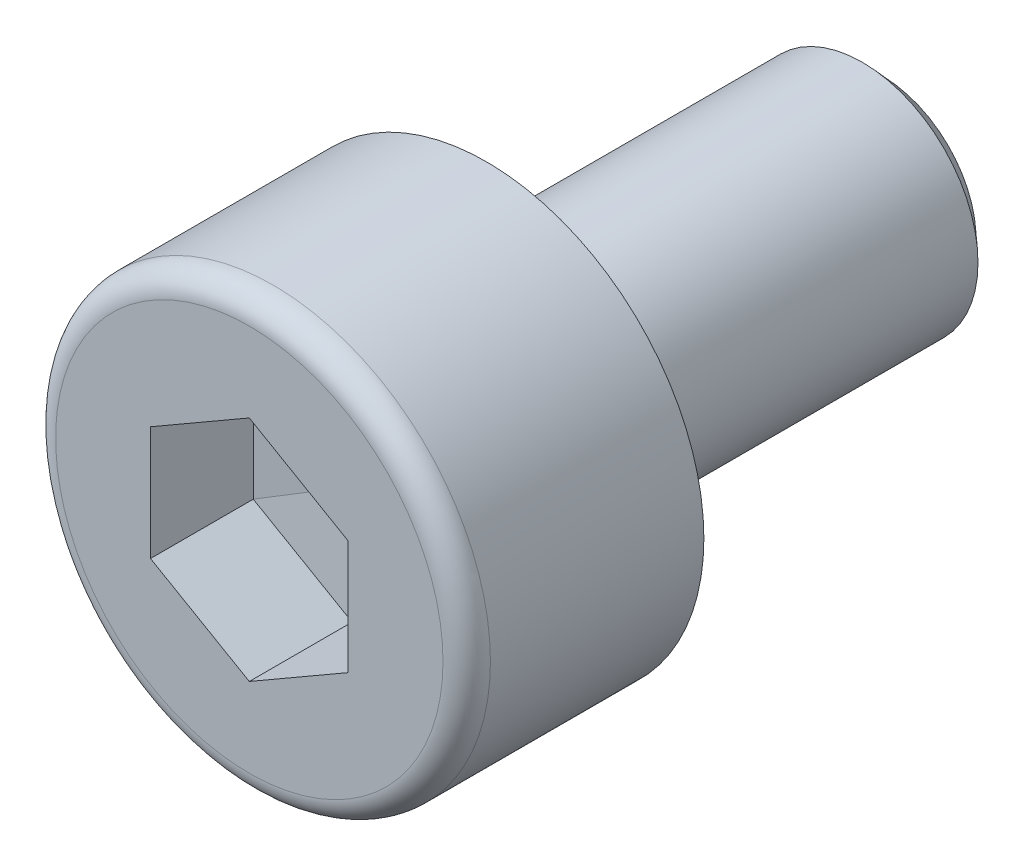
ISO-10303-21;
HEADER;
FILE_DESCRIPTION(('STEP AP214'),'2;1');
FILE_NAME('part.step','',(''),(''),'','','');
FILE_SCHEMA(('AUTOMOTIVE_DESIGN { 1 0 10303 214 1 1 1 1 }'));
ENDSEC;
DATA;
#1=APPLICATION_CONTEXT('core data for automotive mechanical design processes');
#2=APPLICATION_PROTOCOL_DEFINITION('international standard','automotive_design',2000,#1);
#3=PRODUCT_CONTEXT('',#1,'mechanical');
#4=PRODUCT('Part','Part','',(#3));
#5=PRODUCT_RELATED_PRODUCT_CATEGORY('part','',(#4));
#6=PRODUCT_DEFINITION_FORMATION('','',#4);
#7=PRODUCT_DEFINITION_CONTEXT('part definition',#1,'design');
#8=PRODUCT_DEFINITION('design','',#6,#7);
#9=PRODUCT_DEFINITION_SHAPE('','',#8);
#10=(LENGTH_UNIT() NAMED_UNIT(*) SI_UNIT(.MILLI.,.METRE.));
#11=(NAMED_UNIT(*) PLANE_ANGLE_UNIT() SI_UNIT($,.RADIAN.));
#12=(NAMED_UNIT(*) SI_UNIT($,.STERADIAN.) SOLID_ANGLE_UNIT());
#13=UNCERTAINTY_MEASURE_WITH_UNIT(LENGTH_MEASURE(1.E-05),#10,'distance_accuracy_value','');
#14=(GEOMETRIC_REPRESENTATION_CONTEXT(3) GLOBAL_UNCERTAINTY_ASSIGNED_CONTEXT((#13)) GLOBAL_UNIT_ASSIGNED_CONTEXT((#10,
#11,#12)) REPRESENTATION_CONTEXT('',''));
#15=CARTESIAN_POINT('',(0.,0.,0.));
#16=DIRECTION('',(0.,0.,1.));
#17=DIRECTION('',(1.,0.,0.));
#18=AXIS2_PLACEMENT_3D('',#15,#16,#17);
#19=CARTESIAN_POINT('',(-1.5,0.,-1.93470335983093E-13));
#20=DIRECTION('',(0.,0.,-1.));
#21=DIRECTION('',(0.,-1.,0.));
#22=AXIS2_PLACEMENT_3D('',#19,#20,#21);
#23=PLANE('',#22);
#24=CARTESIAN_POINT('',(0.,0.,-1.85684800868557E-13));
#25=DIRECTION('',(0.,0.,-1.));
#26=DIRECTION('',(-1.,0.,0.));
#27=AXIS2_PLACEMENT_3D('',#24,#25,#26);
#28=CIRCLE('',#27,1.4635);
#29=CARTESIAN_POINT('',(-1.46350000000002,0.,-1.93638144305223E-13));
#30=VERTEX_POINT('',#29);
#31=EDGE_CURVE('E11',#30,#30,#28,.T.);
#32=ORIENTED_EDGE('',*,*,#31,.F.);
#33=EDGE_LOOP('',(#32));
#34=FACE_BOUND('',#33,.T.);
#35=CARTESIAN_POINT('',(0.,0.,-3.44906201260506E-13));
#36=DIRECTION('',(0.,0.,-1.));
#37=DIRECTION('',(1.,0.,0.));
#38=AXIS2_PLACEMENT_3D('',#35,#36,#37);
#39=CIRCLE('',#38,2.75);
#40=CARTESIAN_POINT('',(2.74999999999998,0.,-3.30510349980983E-13));
#41=VERTEX_POINT('',#40);
#42=EDGE_CURVE('E146',#41,#41,#39,.T.);
#43=ORIENTED_EDGE('',*,*,#42,.T.);
#44=EDGE_LOOP('',(#43));
#45=FACE_BOUND('',#44,.T.);
#46=ADVANCED_FACE('F17',(#34,#45),#23,.T.);
#47=CARTESIAN_POINT('',(0.,0.,-5.));
#48=DIRECTION('',(0.,0.,-1.));
#49=DIRECTION('',(0.,-1.,0.));
#50=AXIS2_PLACEMENT_3D('',#47,#48,#49);
#51=PLANE('',#50);
#52=CARTESIAN_POINT('',(0.,0.,-5.));
#53=DIRECTION('',(0.,0.,-1.));
#54=DIRECTION('',(-1.,0.,0.));
#55=AXIS2_PLACEMENT_3D('',#52,#53,#54);
#56=CIRCLE('',#55,1.193275);
#57=CARTESIAN_POINT('',(-1.193275,0.,-5.));
#58=VERTEX_POINT('',#57);
#59=EDGE_CURVE('E280',#58,#58,#56,.T.);
#60=ORIENTED_EDGE('',*,*,#59,.T.);
#61=EDGE_LOOP('',(#60));
#62=FACE_BOUND('',#61,.T.);
#63=ADVANCED_FACE('F314',(#62),#51,.T.);
#64=CARTESIAN_POINT('',(0.,0.,-2.50000000000009));
#65=DIRECTION('',(0.,0.,-1.));
#66=DIRECTION('',(-1.,0.,0.));
#67=AXIS2_PLACEMENT_3D('',#64,#65,#66);
#68=CYLINDRICAL_SURFACE('',#67,1.4635);
#69=ORIENTED_EDGE('',*,*,#31,.T.);
#70=EDGE_LOOP('',(#69));
#71=FACE_BOUND('',#70,.T.);
#72=CARTESIAN_POINT('',(0.,0.,-4.75385028398544));
#73=DIRECTION('',(0.,0.,1.));
#74=DIRECTION('',(-1.,0.,0.));
#75=AXIS2_PLACEMENT_3D('',#72,#73,#74);
#76=CIRCLE('',#75,1.4635);
#77=CARTESIAN_POINT('',(-1.4635,0.,-4.75385028398545));
#78=VERTEX_POINT('',#77);
#79=EDGE_CURVE('E288',#78,#78,#76,.T.);
#80=ORIENTED_EDGE('',*,*,#79,.T.);
#81=EDGE_LOOP('',(#80));
#82=FACE_BOUND('',#81,.T.);
#83=ADVANCED_FACE('F298',(#71,#82),#68,.T.);
#84=CARTESIAN_POINT('',(0.,-1.44337567297406,3.));
#85=DIRECTION('',(-0.5,-0.866025403784439,0.));
#86=DIRECTION('',(-0.866025403784439,0.5,0.));
#87=AXIS2_PLACEMENT_3D('',#84,#85,#86);
#88=PLANE('',#87);
#89=DIRECTION('',(-0.866025403784439,0.5,0.));
#90=VECTOR('',#89,1.);
#91=CARTESIAN_POINT('',(-1.34375,-0.667561248750502,2.99999999999965));
#92=LINE('',#91,#90);
#93=CARTESIAN_POINT('',(0.,-1.44337567297406,3.));
#94=VERTEX_POINT('',#93);
#95=CARTESIAN_POINT('',(-1.25,-0.721687836487032,3.));
#96=VERTEX_POINT('',#95);
#97=EDGE_CURVE('E107',#94,#96,#92,.T.);
#98=ORIENTED_EDGE('',*,*,#97,.F.);
#99=DIRECTION('',(0.,0.,-1.));
#100=VECTOR('',#99,1.);
#101=CARTESIAN_POINT('',(0.,-1.44337567297406,3.));
#102=LINE('',#101,#100);
#103=CARTESIAN_POINT('',(0.,-1.44337567297406,1.7));
#104=VERTEX_POINT('',#103);
#105=EDGE_CURVE('E92',#94,#104,#102,.T.);
#106=ORIENTED_EDGE('',*,*,#105,.T.);
#107=DIRECTION('',(-0.866025403784439,0.5,0.));
#108=VECTOR('',#107,1.);
#109=CARTESIAN_POINT('',(-1.25,-0.721687836487032,1.7));
#110=LINE('',#109,#108);
#111=CARTESIAN_POINT('',(-1.25,-0.721687836487032,1.7));
#112=VERTEX_POINT('',#111);
#113=EDGE_CURVE('E186',#104,#112,#110,.T.);
#114=ORIENTED_EDGE('',*,*,#113,.T.);
#115=DIRECTION('',(0.,0.,-1.));
#116=VECTOR('',#115,1.);
#117=CARTESIAN_POINT('',(-1.25,-0.721687836487032,3.));
#118=LINE('',#117,#116);
#119=EDGE_CURVE('E25',#96,#112,#118,.T.);
#120=ORIENTED_EDGE('',*,*,#119,.F.);
#121=EDGE_LOOP('',(#98,#106,#114,#120));
#122=FACE_BOUND('',#121,.T.);
#123=ADVANCED_FACE('F108',(#122),#88,.F.);
#124=CARTESIAN_POINT('',(-1.25,-0.721687836487032,3.));
#125=DIRECTION('',(-1.,0.,0.));
#126=DIRECTION('',(0.,0.,1.));
#127=AXIS2_PLACEMENT_3D('',#124,#125,#126);
#128=PLANE('',#127);
#129=DIRECTION('',(0.,1.,0.));
#130=VECTOR('',#129,1.);
#131=CARTESIAN_POINT('',(-1.25,-0.360843918243516,2.99999999999965));
#132=LINE('',#131,#130);
#133=CARTESIAN_POINT('',(-1.25,0.721687836487033,3.));
#134=VERTEX_POINT('',#133);
#135=EDGE_CURVE('E112',#96,#134,#132,.T.);
#136=ORIENTED_EDGE('',*,*,#135,.F.);
#137=ORIENTED_EDGE('',*,*,#119,.T.);
#138=DIRECTION('',(0.,1.,0.));
#139=VECTOR('',#138,1.);
#140=CARTESIAN_POINT('',(-1.25,0.721687836487033,1.7));
#141=LINE('',#140,#139);
#142=CARTESIAN_POINT('',(-1.25,0.721687836487033,1.7));
#143=VERTEX_POINT('',#142);
#144=EDGE_CURVE('E180',#112,#143,#141,.T.);
#145=ORIENTED_EDGE('',*,*,#144,.T.);
#146=DIRECTION('',(0.,0.,-1.));
#147=VECTOR('',#146,1.);
#148=CARTESIAN_POINT('',(-1.25,0.721687836487033,3.));
#149=LINE('',#148,#147);
#150=EDGE_CURVE('E46',#134,#143,#149,.T.);
#151=ORIENTED_EDGE('',*,*,#150,.F.);
#152=EDGE_LOOP('',(#136,#137,#145,#151));
#153=FACE_BOUND('',#152,.T.);
#154=ADVANCED_FACE('F347',(#153),#128,.F.);
#155=CARTESIAN_POINT('',(-1.25,0.721687836487033,3.));
#156=DIRECTION('',(-0.5,0.866025403784439,0.));
#157=DIRECTION('',(0.,0.,1.));
#158=AXIS2_PLACEMENT_3D('',#155,#156,#157);
#159=PLANE('',#158);
#160=DIRECTION('',(0.866025403784439,0.5,0.));
#161=VECTOR('',#160,1.);
#162=CARTESIAN_POINT('',(-1.96875,0.306717330506986,2.99999999999964));
#163=LINE('',#162,#161);
#164=CARTESIAN_POINT('',(0.,1.44337567297406,3.));
#165=VERTEX_POINT('',#164);
#166=EDGE_CURVE('E133',#134,#165,#163,.T.);
#167=ORIENTED_EDGE('',*,*,#166,.F.);
#168=ORIENTED_EDGE('',*,*,#150,.T.);
#169=DIRECTION('',(0.866025403784439,0.5,0.));
#170=VECTOR('',#169,1.);
#171=CARTESIAN_POINT('',(0.,1.44337567297406,1.7));
#172=LINE('',#171,#170);
#173=CARTESIAN_POINT('',(0.,1.44337567297406,1.7));
#174=VERTEX_POINT('',#173);
#175=EDGE_CURVE('E170',#143,#174,#172,.T.);
#176=ORIENTED_EDGE('',*,*,#175,.T.);
#177=DIRECTION('',(0.,0.,-1.));
#178=VECTOR('',#177,1.);
#179=CARTESIAN_POINT('',(0.,1.44337567297406,3.));
#180=LINE('',#179,#178);
#181=EDGE_CURVE('E171',#165,#174,#180,.T.);
#182=ORIENTED_EDGE('',*,*,#181,.F.);
#183=EDGE_LOOP('',(#167,#168,#176,#182));
#184=FACE_BOUND('',#183,.T.);
#185=ADVANCED_FACE('F370',(#184),#159,.F.);
#186=CARTESIAN_POINT('',(0.,1.44337567297406,3.));
#187=DIRECTION('',(0.5,0.866025403784439,0.));
#188=DIRECTION('',(0.,0.,-1.));
#189=AXIS2_PLACEMENT_3D('',#186,#187,#188);
#190=PLANE('',#189);
#191=DIRECTION('',(0.866025403784439,-0.5,0.));
#192=VECTOR('',#191,1.);
#193=CARTESIAN_POINT('',(-0.71875,1.85834617895411,2.99999999999965));
#194=LINE('',#193,#192);
#195=CARTESIAN_POINT('',(1.25,0.721687836487032,3.));
#196=VERTEX_POINT('',#195);
#197=EDGE_CURVE('E137',#165,#196,#194,.T.);
#198=ORIENTED_EDGE('',*,*,#197,.F.);
#199=ORIENTED_EDGE('',*,*,#181,.T.);
#200=DIRECTION('',(0.866025403784439,-0.5,0.));
#201=VECTOR('',#200,1.);
#202=CARTESIAN_POINT('',(1.25,0.721687836487032,1.7));
#203=LINE('',#202,#201);
#204=CARTESIAN_POINT('',(1.25,0.721687836487032,1.7));
#205=VERTEX_POINT('',#204);
#206=EDGE_CURVE('E140',#174,#205,#203,.T.);
#207=ORIENTED_EDGE('',*,*,#206,.T.);
#208=DIRECTION('',(0.,0.,-1.));
#209=VECTOR('',#208,1.);
#210=CARTESIAN_POINT('',(1.25,0.721687836487032,3.));
#211=LINE('',#210,#209);
#212=EDGE_CURVE('E103',#196,#205,#211,.T.);
#213=ORIENTED_EDGE('',*,*,#212,.F.);
#214=EDGE_LOOP('',(#198,#199,#207,#213));
#215=FACE_BOUND('',#214,.T.);
#216=ADVANCED_FACE('F366',(#215),#190,.F.);
#217=CARTESIAN_POINT('',(1.25,0.721687836487032,3.));
#218=DIRECTION('',(1.,0.,0.));
#219=DIRECTION('',(0.,1.,0.));
#220=AXIS2_PLACEMENT_3D('',#217,#218,#219);
#221=PLANE('',#220);
#222=DIRECTION('',(0.,-1.,0.));
#223=VECTOR('',#222,1.);
#224=CARTESIAN_POINT('',(1.25,0.360843918243516,2.99999999999966));
#225=LINE('',#224,#223);
#226=CARTESIAN_POINT('',(1.25,-0.721687836487032,3.));
#227=VERTEX_POINT('',#226);
#228=EDGE_CURVE('E119',#196,#227,#225,.T.);
#229=ORIENTED_EDGE('',*,*,#228,.F.);
#230=ORIENTED_EDGE('',*,*,#212,.T.);
#231=DIRECTION('',(0.,-1.,0.));
#232=VECTOR('',#231,1.);
#233=CARTESIAN_POINT('',(1.25,-0.721687836487032,1.7));
#234=LINE('',#233,#232);
#235=CARTESIAN_POINT('',(1.25,-0.721687836487032,1.7));
#236=VERTEX_POINT('',#235);
#237=EDGE_CURVE('E158',#205,#236,#234,.T.);
#238=ORIENTED_EDGE('',*,*,#237,.T.);
#239=DIRECTION('',(0.,0.,-1.));
#240=VECTOR('',#239,1.);
#241=CARTESIAN_POINT('',(1.25,-0.721687836487032,3.));
#242=LINE('',#241,#240);
#243=EDGE_CURVE('E104',#227,#236,#242,.T.);
#244=ORIENTED_EDGE('',*,*,#243,.F.);
#245=EDGE_LOOP('',(#229,#230,#238,#244));
#246=FACE_BOUND('',#245,.T.);
#247=ADVANCED_FACE('F360',(#246),#221,.F.);
#248=CARTESIAN_POINT('',(1.25,-0.721687836487032,3.));
#249=DIRECTION('',(0.5,-0.866025403784439,0.));
#250=DIRECTION('',(0.,0.,-1.));
#251=AXIS2_PLACEMENT_3D('',#248,#249,#250);
#252=PLANE('',#251);
#253=DIRECTION('',(-0.866025403784439,-0.5,0.));
#254=VECTOR('',#253,1.);
#255=CARTESIAN_POINT('',(-0.0937500000000048,-1.4975022607106,2.99999999999965));
#256=LINE('',#255,#254);
#257=EDGE_CURVE('E96',#227,#94,#256,.T.);
#258=ORIENTED_EDGE('',*,*,#257,.F.);
#259=ORIENTED_EDGE('',*,*,#243,.T.);
#260=DIRECTION('',(-0.866025403784439,-0.5,0.));
#261=VECTOR('',#260,1.);
#262=CARTESIAN_POINT('',(0.,-1.44337567297406,1.7));
#263=LINE('',#262,#261);
#264=EDGE_CURVE('E98',#236,#104,#263,.T.);
#265=ORIENTED_EDGE('',*,*,#264,.T.);
#266=ORIENTED_EDGE('',*,*,#105,.F.);
#267=EDGE_LOOP('',(#258,#259,#265,#266));
#268=FACE_BOUND('',#267,.T.);
#269=ADVANCED_FACE('F94',(#268),#252,.F.);
#270=CARTESIAN_POINT('',(-1.25,-0.721687836487032,1.7));
#271=DIRECTION('',(-0.043577871373829,-0.0754790873051733,-0.996194698091746));
#272=DIRECTION('',(0.,-0.997141949694317,0.0755508581011305));
#273=AXIS2_PLACEMENT_3D('',#270,#271,#272);
#274=PLANE('',#273);
#275=DIRECTION('',(0.863550259614423,0.498570974847158,-0.0755508581011305));
#276=VECTOR('',#275,1.);
#277=CARTESIAN_POINT('',(-0.939283728799944,-0.542295713668081,1.67281584869695));
#278=LINE('',#277,#276);
#279=CARTESIAN_POINT('',(0.,0.,1.5906391705926));
#280=VERTEX_POINT('',#279);
#281=EDGE_CURVE('E183',#112,#280,#278,.T.);
#282=ORIENTED_EDGE('',*,*,#281,.F.);
#283=ORIENTED_EDGE('',*,*,#113,.F.);
#284=DIRECTION('',(0.,0.997141949694317,-0.0755508581011306));
#285=VECTOR('',#284,1.);
#286=CARTESIAN_POINT('',(0.,-1.08459142733616,1.67281584869695));
#287=LINE('',#286,#285);
#288=EDGE_CURVE('E150',#104,#280,#287,.T.);
#289=ORIENTED_EDGE('',*,*,#288,.T.);
#290=EDGE_LOOP('',(#282,#283,#289));
#291=FACE_BOUND('',#290,.T.);
#292=ADVANCED_FACE('F356',(#291),#274,.F.);
#293=CARTESIAN_POINT('',(-1.25,0.721687836487033,1.7));
#294=DIRECTION('',(-0.0871557427476581,0.,-0.996194698091746));
#295=DIRECTION('',(-0.996194698091746,0.,0.0871557427476581));
#296=AXIS2_PLACEMENT_3D('',#293,#294,#295);
#297=PLANE('',#296);
#298=DIRECTION('',(0.863550259614423,-0.498570974847159,-0.0755508581011305));
#299=VECTOR('',#298,1.);
#300=CARTESIAN_POINT('',(-0.939283728799943,0.542295713668083,1.67281584869695));
#301=LINE('',#300,#299);
#302=EDGE_CURVE('E176',#143,#280,#301,.T.);
#303=ORIENTED_EDGE('',*,*,#302,.F.);
#304=ORIENTED_EDGE('',*,*,#144,.F.);
#305=ORIENTED_EDGE('',*,*,#281,.T.);
#306=EDGE_LOOP('',(#303,#304,#305));
#307=FACE_BOUND('',#306,.T.);
#308=ADVANCED_FACE('F342',(#307),#297,.F.);
#309=CARTESIAN_POINT('',(0.,1.44337567297406,1.7));
#310=DIRECTION('',(-0.043577871373829,0.0754790873051733,-0.996194698091746));
#311=DIRECTION('',(-0.999044587684655,0.,0.043702537889669));
#312=AXIS2_PLACEMENT_3D('',#309,#310,#311);
#313=PLANE('',#312);
#314=DIRECTION('',(0.,-0.997141949694317,-0.0755508581011306));
#315=VECTOR('',#314,1.);
#316=CARTESIAN_POINT('',(0.,1.08459142733616,1.67281584869695));
#317=LINE('',#316,#315);
#318=EDGE_CURVE('E144',#174,#280,#317,.T.);
#319=ORIENTED_EDGE('',*,*,#318,.F.);
#320=ORIENTED_EDGE('',*,*,#175,.F.);
#321=ORIENTED_EDGE('',*,*,#302,.T.);
#322=EDGE_LOOP('',(#319,#320,#321));
#323=FACE_BOUND('',#322,.T.);
#324=ADVANCED_FACE('F339',(#323),#313,.F.);
#325=CARTESIAN_POINT('',(1.25,0.721687836487032,1.7));
#326=DIRECTION('',(0.0435778713738291,0.0754790873051733,-0.996194698091746));
#327=DIRECTION('',(-0.999044587684655,0.,-0.0437025378896691));
#328=AXIS2_PLACEMENT_3D('',#325,#326,#327);
#329=PLANE('',#328);
#330=DIRECTION('',(-0.863550259614423,-0.498570974847158,-0.0755508581011305));
#331=VECTOR('',#330,1.);
#332=CARTESIAN_POINT('',(0.939283728799944,0.542295713668082,1.67281584869695));
#333=LINE('',#332,#331);
#334=EDGE_CURVE('E145',#205,#280,#333,.T.);
#335=ORIENTED_EDGE('',*,*,#334,.F.);
#336=ORIENTED_EDGE('',*,*,#206,.F.);
#337=ORIENTED_EDGE('',*,*,#318,.T.);
#338=EDGE_LOOP('',(#335,#336,#337));
#339=FACE_BOUND('',#338,.T.);
#340=ADVANCED_FACE('F341',(#339),#329,.F.);
#341=CARTESIAN_POINT('',(1.25,-0.721687836487032,1.7));
#342=DIRECTION('',(0.0871557427476581,0.,-0.996194698091746));
#343=DIRECTION('',(0.,-1.,0.));
#344=AXIS2_PLACEMENT_3D('',#341,#342,#343);
#345=PLANE('',#344);
#346=DIRECTION('',(-0.863550259614423,0.498570974847158,-0.0755508581011305));
#347=VECTOR('',#346,1.);
#348=CARTESIAN_POINT('',(0.939283728799943,-0.542295713668083,1.67281584869695));
#349=LINE('',#348,#347);
#350=EDGE_CURVE('E154',#236,#280,#349,.T.);
#351=ORIENTED_EDGE('',*,*,#350,.F.);
#352=ORIENTED_EDGE('',*,*,#237,.F.);
#353=ORIENTED_EDGE('',*,*,#334,.T.);
#354=EDGE_LOOP('',(#351,#352,#353));
#355=FACE_BOUND('',#354,.T.);
#356=ADVANCED_FACE('F334',(#355),#345,.F.);
#357=CARTESIAN_POINT('',(0.,-1.44337567297406,1.7));
#358=DIRECTION('',(0.0435778713738291,-0.0754790873051733,-0.996194698091746));
#359=DIRECTION('',(0.,-0.997141949694317,0.0755508581011305));
#360=AXIS2_PLACEMENT_3D('',#357,#358,#359);
#361=PLANE('',#360);
#362=ORIENTED_EDGE('',*,*,#288,.F.);
#363=ORIENTED_EDGE('',*,*,#264,.F.);
#364=ORIENTED_EDGE('',*,*,#350,.T.);
#365=EDGE_LOOP('',(#362,#363,#364));
#366=FACE_BOUND('',#365,.T.);
#367=ADVANCED_FACE('F326',(#366),#361,.F.);
#368=CARTESIAN_POINT('',(0.,0.,1.49999999999966));
#369=DIRECTION('',(0.,0.,-1.));
#370=DIRECTION('',(-1.,0.,0.));
#371=AXIS2_PLACEMENT_3D('',#368,#369,#370);
#372=CYLINDRICAL_SURFACE('',#371,2.75);
#373=CARTESIAN_POINT('',(0.,0.,2.69999999999965));
#374=DIRECTION('',(0.,0.,1.));
#375=DIRECTION('',(1.,0.,0.));
#376=AXIS2_PLACEMENT_3D('',#373,#374,#375);
#377=CIRCLE('',#376,2.75);
#378=CARTESIAN_POINT('',(2.74999999999996,0.,2.69999999999966));
#379=VERTEX_POINT('',#378);
#380=EDGE_CURVE('E128',#379,#379,#377,.T.);
#381=ORIENTED_EDGE('',*,*,#380,.F.);
#382=EDGE_LOOP('',(#381));
#383=FACE_BOUND('',#382,.T.);
#384=ORIENTED_EDGE('',*,*,#42,.F.);
#385=EDGE_LOOP('',(#384));
#386=FACE_BOUND('',#385,.T.);
#387=ADVANCED_FACE('F324',(#383,#386),#372,.T.);
#388=CARTESIAN_POINT('',(-2.75,0.,2.99999999999964));
#389=DIRECTION('',(0.,0.,1.));
#390=DIRECTION('',(1.,0.,0.));
#391=AXIS2_PLACEMENT_3D('',#388,#389,#390);
#392=PLANE('',#391);
#393=ORIENTED_EDGE('',*,*,#257,.T.);
#394=ORIENTED_EDGE('',*,*,#97,.T.);
#395=ORIENTED_EDGE('',*,*,#135,.T.);
#396=ORIENTED_EDGE('',*,*,#166,.T.);
#397=ORIENTED_EDGE('',*,*,#197,.T.);
#398=ORIENTED_EDGE('',*,*,#228,.T.);
#399=EDGE_LOOP('',(#393,#394,#395,#396,#397,#398));
#400=FACE_BOUND('',#399,.T.);
#401=CARTESIAN_POINT('',(0.,0.,2.99999999999966));
#402=DIRECTION('',(0.,0.,-1.));
#403=DIRECTION('',(1.,0.,0.));
#404=AXIS2_PLACEMENT_3D('',#401,#402,#403);
#405=CIRCLE('',#404,2.45);
#406=CARTESIAN_POINT('',(2.44999999999996,0.,2.99999999999967));
#407=VERTEX_POINT('',#406);
#408=EDGE_CURVE('E121',#407,#407,#405,.T.);
#409=ORIENTED_EDGE('',*,*,#408,.F.);
#410=EDGE_LOOP('',(#409));
#411=FACE_BOUND('',#410,.T.);
#412=ADVANCED_FACE('F115',(#400,#411),#392,.T.);
#413=CARTESIAN_POINT('',(0.,0.,2.69999999999965));
#414=DIRECTION('',(0.,0.,-1.));
#415=DIRECTION('',(-1.,0.,0.));
#416=AXIS2_PLACEMENT_3D('',#413,#414,#415);
#417=TOROIDAL_SURFACE('',#416,2.45,0.3);
#418=ORIENTED_EDGE('',*,*,#408,.T.);
#419=EDGE_LOOP('',(#418));
#420=FACE_BOUND('',#419,.T.);
#421=ORIENTED_EDGE('',*,*,#380,.T.);
#422=EDGE_LOOP('',(#421));
#423=FACE_BOUND('',#422,.T.);
#424=ADVANCED_FACE('F302',(#420,#423),#417,.T.);
#425=CARTESIAN_POINT('',(0.,0.,-4.8466375));
#426=DIRECTION('',(0.,0.,1.));
#427=DIRECTION('',(-1.,0.,0.));
#428=AXIS2_PLACEMENT_3D('',#425,#426,#427);
#429=CONICAL_SURFACE('',#428,1.36163749999999,0.831988093683003);
#430=ORIENTED_EDGE('',*,*,#59,.F.);
#431=EDGE_LOOP('',(#430));
#432=FACE_BOUND('',#431,.T.);
#433=ORIENTED_EDGE('',*,*,#79,.F.);
#434=EDGE_LOOP('',(#433));
#435=FACE_BOUND('',#434,.T.);
#436=ADVANCED_FACE('F300',(#432,#435),#429,.T.);
#437=CLOSED_SHELL('',(#46,#63,#83,#123,#154,#185,#216,#247,#269,#292,#308,#324,#340,#356,#367,
#387,#412,#424,#436));
#438=MANIFOLD_SOLID_BREP('B1',#437);
#439=ADVANCED_BREP_SHAPE_REPRESENTATION('',(#18,#438),#14);
#440=SHAPE_DEFINITION_REPRESENTATION(#9,#439);
ENDSEC;
END-ISO-10303-21;
